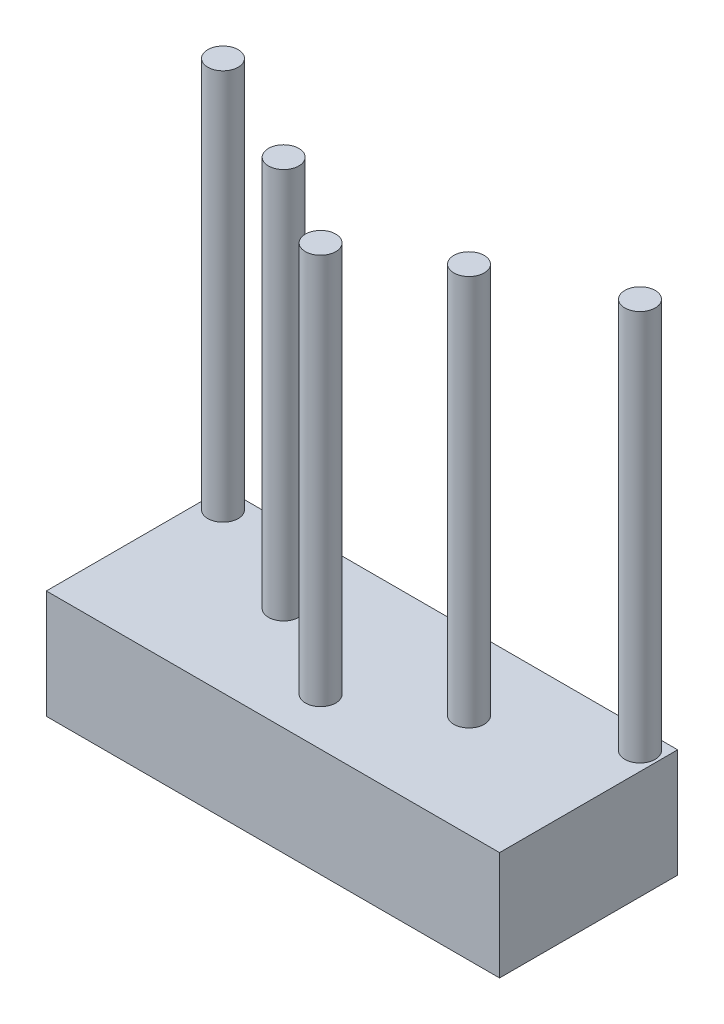
ISO-10303-21;
HEADER;
FILE_DESCRIPTION(('STEP AP214'),'2;1');
FILE_NAME('part.step','',(''),(''),'','','');
FILE_SCHEMA(('AUTOMOTIVE_DESIGN { 1 0 10303 214 1 1 1 1 }'));
ENDSEC;
DATA;
#1=APPLICATION_CONTEXT('core data for automotive mechanical design processes');
#2=APPLICATION_PROTOCOL_DEFINITION('international standard','automotive_design',2000,#1);
#3=PRODUCT_CONTEXT('',#1,'mechanical');
#4=PRODUCT('Part','Part','',(#3));
#5=PRODUCT_RELATED_PRODUCT_CATEGORY('part','',(#4));
#6=PRODUCT_DEFINITION_FORMATION('','',#4);
#7=PRODUCT_DEFINITION_CONTEXT('part definition',#1,'design');
#8=PRODUCT_DEFINITION('design','',#6,#7);
#9=PRODUCT_DEFINITION_SHAPE('','',#8);
#10=(LENGTH_UNIT() NAMED_UNIT(*) SI_UNIT(.MILLI.,.METRE.));
#11=(NAMED_UNIT(*) PLANE_ANGLE_UNIT() SI_UNIT($,.RADIAN.));
#12=(NAMED_UNIT(*) SI_UNIT($,.STERADIAN.) SOLID_ANGLE_UNIT());
#13=UNCERTAINTY_MEASURE_WITH_UNIT(LENGTH_MEASURE(1.E-05),#10,'distance_accuracy_value','');
#14=(GEOMETRIC_REPRESENTATION_CONTEXT(3) GLOBAL_UNCERTAINTY_ASSIGNED_CONTEXT((#13)) GLOBAL_UNIT_ASSIGNED_CONTEXT((#10,
#11,#12)) REPRESENTATION_CONTEXT('',''));
#15=CARTESIAN_POINT('',(0.,0.,0.));
#16=DIRECTION('',(0.,0.,1.));
#17=DIRECTION('',(1.,0.,0.));
#18=AXIS2_PLACEMENT_3D('',#15,#16,#17);
#19=CARTESIAN_POINT('',(-39.751,19.05,-15.621));
#20=DIRECTION('',(1.,0.,0.));
#21=DIRECTION('',(0.,0.,-1.));
#22=AXIS2_PLACEMENT_3D('',#19,#20,#21);
#23=PLANE('',#22);
#24=DIRECTION('',(0.,0.,1.));
#25=VECTOR('',#24,1.);
#26=CARTESIAN_POINT('',(-39.751,0.,-15.621));
#27=LINE('',#26,#25);
#28=CARTESIAN_POINT('',(-39.751,0.,-15.621));
#29=VERTEX_POINT('',#28);
#30=CARTESIAN_POINT('',(-39.751,0.,15.621));
#31=VERTEX_POINT('',#30);
#32=EDGE_CURVE('E99',#29,#31,#27,.T.);
#33=ORIENTED_EDGE('',*,*,#32,.T.);
#34=DIRECTION('',(0.,-1.,0.));
#35=VECTOR('',#34,1.);
#36=CARTESIAN_POINT('',(-39.751,19.05,15.621));
#37=LINE('',#36,#35);
#38=CARTESIAN_POINT('',(-39.751,19.05,15.621));
#39=VERTEX_POINT('',#38);
#40=EDGE_CURVE('E11',#39,#31,#37,.T.);
#41=ORIENTED_EDGE('',*,*,#40,.F.);
#42=DIRECTION('',(0.,0.,1.));
#43=VECTOR('',#42,1.);
#44=CARTESIAN_POINT('',(-39.751,19.05,-15.621));
#45=LINE('',#44,#43);
#46=CARTESIAN_POINT('',(-39.751,19.05,-15.621));
#47=VERTEX_POINT('',#46);
#48=EDGE_CURVE('E87',#47,#39,#45,.T.);
#49=ORIENTED_EDGE('',*,*,#48,.F.);
#50=DIRECTION('',(0.,-1.,0.));
#51=VECTOR('',#50,1.);
#52=CARTESIAN_POINT('',(-39.751,19.05,-15.621));
#53=LINE('',#52,#51);
#54=EDGE_CURVE('E95',#47,#29,#53,.T.);
#55=ORIENTED_EDGE('',*,*,#54,.T.);
#56=EDGE_LOOP('',(#33,#41,#49,#55));
#57=FACE_BOUND('',#56,.T.);
#58=ADVANCED_FACE('F36',(#57),#23,.F.);
#59=CARTESIAN_POINT('',(-39.751,19.05,15.621));
#60=DIRECTION('',(0.,0.,-1.));
#61=DIRECTION('',(-1.,0.,0.));
#62=AXIS2_PLACEMENT_3D('',#59,#60,#61);
#63=PLANE('',#62);
#64=DIRECTION('',(1.,0.,0.));
#65=VECTOR('',#64,1.);
#66=CARTESIAN_POINT('',(-39.751,0.,15.621));
#67=LINE('',#66,#65);
#68=CARTESIAN_POINT('',(39.751,0.,15.621));
#69=VERTEX_POINT('',#68);
#70=EDGE_CURVE('E91',#31,#69,#67,.T.);
#71=ORIENTED_EDGE('',*,*,#70,.T.);
#72=DIRECTION('',(0.,-1.,0.));
#73=VECTOR('',#72,1.);
#74=CARTESIAN_POINT('',(39.751,19.05,15.621));
#75=LINE('',#74,#73);
#76=CARTESIAN_POINT('',(39.751,19.05,15.621));
#77=VERTEX_POINT('',#76);
#78=EDGE_CURVE('E44',#77,#69,#75,.T.);
#79=ORIENTED_EDGE('',*,*,#78,.F.);
#80=DIRECTION('',(1.,0.,0.));
#81=VECTOR('',#80,1.);
#82=CARTESIAN_POINT('',(-39.751,19.05,15.621));
#83=LINE('',#82,#81);
#84=EDGE_CURVE('E82',#39,#77,#83,.T.);
#85=ORIENTED_EDGE('',*,*,#84,.F.);
#86=ORIENTED_EDGE('',*,*,#40,.T.);
#87=EDGE_LOOP('',(#71,#79,#85,#86));
#88=FACE_BOUND('',#87,.T.);
#89=ADVANCED_FACE('F90',(#88),#63,.F.);
#90=CARTESIAN_POINT('',(39.751,19.05,-15.621));
#91=DIRECTION('',(-1.,0.,0.));
#92=DIRECTION('',(0.,0.,1.));
#93=AXIS2_PLACEMENT_3D('',#90,#91,#92);
#94=PLANE('',#93);
#95=DIRECTION('',(0.,0.,-1.));
#96=VECTOR('',#95,1.);
#97=CARTESIAN_POINT('',(39.751,0.,-15.621));
#98=LINE('',#97,#96);
#99=CARTESIAN_POINT('',(39.751,0.,-15.621));
#100=VERTEX_POINT('',#99);
#101=EDGE_CURVE('E69',#69,#100,#98,.T.);
#102=ORIENTED_EDGE('',*,*,#101,.T.);
#103=DIRECTION('',(0.,-1.,0.));
#104=VECTOR('',#103,1.);
#105=CARTESIAN_POINT('',(39.751,19.05,-15.621));
#106=LINE('',#105,#104);
#107=CARTESIAN_POINT('',(39.751,19.05,-15.621));
#108=VERTEX_POINT('',#107);
#109=EDGE_CURVE('E92',#108,#100,#106,.T.);
#110=ORIENTED_EDGE('',*,*,#109,.F.);
#111=DIRECTION('',(0.,0.,-1.));
#112=VECTOR('',#111,1.);
#113=CARTESIAN_POINT('',(39.751,19.05,-15.621));
#114=LINE('',#113,#112);
#115=EDGE_CURVE('E85',#77,#108,#114,.T.);
#116=ORIENTED_EDGE('',*,*,#115,.F.);
#117=ORIENTED_EDGE('',*,*,#78,.T.);
#118=EDGE_LOOP('',(#102,#110,#116,#117));
#119=FACE_BOUND('',#118,.T.);
#120=ADVANCED_FACE('F93',(#119),#94,.F.);
#121=CARTESIAN_POINT('',(-39.751,19.05,-15.621));
#122=DIRECTION('',(0.,0.,1.));
#123=DIRECTION('',(1.,0.,0.));
#124=AXIS2_PLACEMENT_3D('',#121,#122,#123);
#125=PLANE('',#124);
#126=DIRECTION('',(-1.,0.,0.));
#127=VECTOR('',#126,1.);
#128=CARTESIAN_POINT('',(-39.751,0.,-15.621));
#129=LINE('',#128,#127);
#130=EDGE_CURVE('E75',#100,#29,#129,.T.);
#131=ORIENTED_EDGE('',*,*,#130,.T.);
#132=ORIENTED_EDGE('',*,*,#54,.F.);
#133=DIRECTION('',(-1.,0.,0.));
#134=VECTOR('',#133,1.);
#135=CARTESIAN_POINT('',(-39.751,19.05,-15.621));
#136=LINE('',#135,#134);
#137=EDGE_CURVE('E52',#108,#47,#136,.T.);
#138=ORIENTED_EDGE('',*,*,#137,.F.);
#139=ORIENTED_EDGE('',*,*,#109,.T.);
#140=EDGE_LOOP('',(#131,#132,#138,#139));
#141=FACE_BOUND('',#140,.T.);
#142=ADVANCED_FACE('F107',(#141),#125,.F.);
#143=CARTESIAN_POINT('',(0.,19.05,0.));
#144=DIRECTION('',(0.,1.,0.));
#145=DIRECTION('',(0.,0.,1.));
#146=AXIS2_PLACEMENT_3D('',#143,#144,#145);
#147=PLANE('',#146);
#148=CARTESIAN_POINT('',(36.576,19.05,-12.192));
#149=DIRECTION('',(0.,1.,0.));
#150=DIRECTION('',(0.,0.,1.));
#151=AXIS2_PLACEMENT_3D('',#148,#149,#150);
#152=CIRCLE('',#151,2.667);
#153=CARTESIAN_POINT('',(36.576,19.05,-9.525));
#154=VERTEX_POINT('',#153);
#155=EDGE_CURVE('E137',#154,#154,#152,.T.);
#156=ORIENTED_EDGE('',*,*,#155,.F.);
#157=EDGE_LOOP('',(#156));
#158=FACE_BOUND('',#157,.T.);
#159=CARTESIAN_POINT('',(16.256,19.05,-2.51513147919641));
#160=DIRECTION('',(0.,1.,0.));
#161=DIRECTION('',(0.,0.,1.));
#162=AXIS2_PLACEMENT_3D('',#159,#160,#161);
#163=CIRCLE('',#162,2.667);
#164=CARTESIAN_POINT('',(16.256,19.05,0.151868520803589));
#165=VERTEX_POINT('',#164);
#166=EDGE_CURVE('E131',#165,#165,#163,.T.);
#167=ORIENTED_EDGE('',*,*,#166,.F.);
#168=EDGE_LOOP('',(#167));
#169=FACE_BOUND('',#168,.T.);
#170=CARTESIAN_POINT('',(0.,19.05,7.26386852080359));
#171=DIRECTION('',(0.,1.,0.));
#172=DIRECTION('',(0.,0.,1.));
#173=AXIS2_PLACEMENT_3D('',#170,#171,#172);
#174=CIRCLE('',#173,2.667);
#175=CARTESIAN_POINT('',(0.,19.05,9.93086852080359));
#176=VERTEX_POINT('',#175);
#177=EDGE_CURVE('E125',#176,#176,#174,.T.);
#178=ORIENTED_EDGE('',*,*,#177,.F.);
#179=EDGE_LOOP('',(#178));
#180=FACE_BOUND('',#179,.T.);
#181=CARTESIAN_POINT('',(-16.256,19.05,-2.51513147919641));
#182=DIRECTION('',(0.,1.,0.));
#183=DIRECTION('',(0.,0.,1.));
#184=AXIS2_PLACEMENT_3D('',#181,#182,#183);
#185=CIRCLE('',#184,2.667);
#186=CARTESIAN_POINT('',(-16.256,19.05,0.151868520803589));
#187=VERTEX_POINT('',#186);
#188=EDGE_CURVE('E119',#187,#187,#185,.T.);
#189=ORIENTED_EDGE('',*,*,#188,.F.);
#190=EDGE_LOOP('',(#189));
#191=FACE_BOUND('',#190,.T.);
#192=CARTESIAN_POINT('',(-36.576,19.05,-12.192));
#193=DIRECTION('',(0.,1.,0.));
#194=DIRECTION('',(0.,0.,1.));
#195=AXIS2_PLACEMENT_3D('',#192,#193,#194);
#196=CIRCLE('',#195,2.667);
#197=CARTESIAN_POINT('',(-36.576,19.05,-9.525));
#198=VERTEX_POINT('',#197);
#199=EDGE_CURVE('E113',#198,#198,#196,.T.);
#200=ORIENTED_EDGE('',*,*,#199,.F.);
#201=EDGE_LOOP('',(#200));
#202=FACE_BOUND('',#201,.T.);
#203=ORIENTED_EDGE('',*,*,#48,.T.);
#204=ORIENTED_EDGE('',*,*,#84,.T.);
#205=ORIENTED_EDGE('',*,*,#115,.T.);
#206=ORIENTED_EDGE('',*,*,#137,.T.);
#207=EDGE_LOOP('',(#203,#204,#205,#206));
#208=FACE_BOUND('',#207,.T.);
#209=ADVANCED_FACE('F83',(#158,#169,#180,#191,#202,#208),#147,.T.);
#210=CARTESIAN_POINT('',(0.,0.,0.));
#211=DIRECTION('',(0.,1.,0.));
#212=DIRECTION('',(0.,0.,1.));
#213=AXIS2_PLACEMENT_3D('',#210,#211,#212);
#214=PLANE('',#213);
#215=ORIENTED_EDGE('',*,*,#32,.F.);
#216=ORIENTED_EDGE('',*,*,#130,.F.);
#217=ORIENTED_EDGE('',*,*,#101,.F.);
#218=ORIENTED_EDGE('',*,*,#70,.F.);
#219=EDGE_LOOP('',(#215,#216,#217,#218));
#220=FACE_BOUND('',#219,.T.);
#221=ADVANCED_FACE('F110',(#220),#214,.F.);
#222=CARTESIAN_POINT('',(-36.576,87.63,-12.192));
#223=DIRECTION('',(0.,-1.,0.));
#224=DIRECTION('',(0.,0.,-1.));
#225=AXIS2_PLACEMENT_3D('',#222,#223,#224);
#226=CYLINDRICAL_SURFACE('',#225,2.667);
#227=CARTESIAN_POINT('',(-36.576,87.63,-12.192));
#228=DIRECTION('',(0.,1.,0.));
#229=DIRECTION('',(0.,0.,1.));
#230=AXIS2_PLACEMENT_3D('',#227,#228,#229);
#231=CIRCLE('',#230,2.667);
#232=CARTESIAN_POINT('',(-36.576,87.63,-9.525));
#233=VERTEX_POINT('',#232);
#234=EDGE_CURVE('E102',#233,#233,#231,.T.);
#235=ORIENTED_EDGE('',*,*,#234,.F.);
#236=EDGE_LOOP('',(#235));
#237=FACE_BOUND('',#236,.T.);
#238=ORIENTED_EDGE('',*,*,#199,.T.);
#239=EDGE_LOOP('',(#238));
#240=FACE_BOUND('',#239,.T.);
#241=ADVANCED_FACE('F163',(#237,#240),#226,.T.);
#242=CARTESIAN_POINT('',(-36.576,87.63,-12.192));
#243=DIRECTION('',(0.,1.,0.));
#244=DIRECTION('',(0.,0.,1.));
#245=AXIS2_PLACEMENT_3D('',#242,#243,#244);
#246=PLANE('',#245);
#247=ORIENTED_EDGE('',*,*,#234,.T.);
#248=EDGE_LOOP('',(#247));
#249=FACE_BOUND('',#248,.T.);
#250=ADVANCED_FACE('F165',(#249),#246,.T.);
#251=CARTESIAN_POINT('',(-16.256,87.63,-2.51513147919641));
#252=DIRECTION('',(0.,-1.,0.));
#253=DIRECTION('',(0.,0.,-1.));
#254=AXIS2_PLACEMENT_3D('',#251,#252,#253);
#255=CYLINDRICAL_SURFACE('',#254,2.667);
#256=CARTESIAN_POINT('',(-16.256,87.63,-2.51513147919641));
#257=DIRECTION('',(0.,1.,0.));
#258=DIRECTION('',(0.,0.,1.));
#259=AXIS2_PLACEMENT_3D('',#256,#257,#258);
#260=CIRCLE('',#259,2.667);
#261=CARTESIAN_POINT('',(-16.256,87.63,0.151868520803589));
#262=VERTEX_POINT('',#261);
#263=EDGE_CURVE('E116',#262,#262,#260,.T.);
#264=ORIENTED_EDGE('',*,*,#263,.F.);
#265=EDGE_LOOP('',(#264));
#266=FACE_BOUND('',#265,.T.);
#267=ORIENTED_EDGE('',*,*,#188,.T.);
#268=EDGE_LOOP('',(#267));
#269=FACE_BOUND('',#268,.T.);
#270=ADVANCED_FACE('F172',(#266,#269),#255,.T.);
#271=CARTESIAN_POINT('',(-16.256,87.63,-2.51513147919641));
#272=DIRECTION('',(0.,1.,0.));
#273=DIRECTION('',(0.,0.,1.));
#274=AXIS2_PLACEMENT_3D('',#271,#272,#273);
#275=PLANE('',#274);
#276=ORIENTED_EDGE('',*,*,#263,.T.);
#277=EDGE_LOOP('',(#276));
#278=FACE_BOUND('',#277,.T.);
#279=ADVANCED_FACE('F220',(#278),#275,.T.);
#280=CARTESIAN_POINT('',(0.,87.63,7.26386852080359));
#281=DIRECTION('',(0.,-1.,0.));
#282=DIRECTION('',(0.,0.,-1.));
#283=AXIS2_PLACEMENT_3D('',#280,#281,#282);
#284=CYLINDRICAL_SURFACE('',#283,2.667);
#285=CARTESIAN_POINT('',(0.,87.63,7.26386852080359));
#286=DIRECTION('',(0.,1.,0.));
#287=DIRECTION('',(0.,0.,1.));
#288=AXIS2_PLACEMENT_3D('',#285,#286,#287);
#289=CIRCLE('',#288,2.667);
#290=CARTESIAN_POINT('',(0.,87.63,9.93086852080359));
#291=VERTEX_POINT('',#290);
#292=EDGE_CURVE('E122',#291,#291,#289,.T.);
#293=ORIENTED_EDGE('',*,*,#292,.F.);
#294=EDGE_LOOP('',(#293));
#295=FACE_BOUND('',#294,.T.);
#296=ORIENTED_EDGE('',*,*,#177,.T.);
#297=EDGE_LOOP('',(#296));
#298=FACE_BOUND('',#297,.T.);
#299=ADVANCED_FACE('F229',(#295,#298),#284,.T.);
#300=CARTESIAN_POINT('',(0.,87.63,7.26386852080359));
#301=DIRECTION('',(0.,1.,0.));
#302=DIRECTION('',(0.,0.,1.));
#303=AXIS2_PLACEMENT_3D('',#300,#301,#302);
#304=PLANE('',#303);
#305=ORIENTED_EDGE('',*,*,#292,.T.);
#306=EDGE_LOOP('',(#305));
#307=FACE_BOUND('',#306,.T.);
#308=ADVANCED_FACE('F238',(#307),#304,.T.);
#309=CARTESIAN_POINT('',(16.256,87.63,-2.51513147919641));
#310=DIRECTION('',(0.,-1.,0.));
#311=DIRECTION('',(0.,0.,-1.));
#312=AXIS2_PLACEMENT_3D('',#309,#310,#311);
#313=CYLINDRICAL_SURFACE('',#312,2.667);
#314=CARTESIAN_POINT('',(16.256,87.63,-2.51513147919641));
#315=DIRECTION('',(0.,1.,0.));
#316=DIRECTION('',(0.,0.,1.));
#317=AXIS2_PLACEMENT_3D('',#314,#315,#316);
#318=CIRCLE('',#317,2.667);
#319=CARTESIAN_POINT('',(16.256,87.63,0.151868520803589));
#320=VERTEX_POINT('',#319);
#321=EDGE_CURVE('E128',#320,#320,#318,.T.);
#322=ORIENTED_EDGE('',*,*,#321,.F.);
#323=EDGE_LOOP('',(#322));
#324=FACE_BOUND('',#323,.T.);
#325=ORIENTED_EDGE('',*,*,#166,.T.);
#326=EDGE_LOOP('',(#325));
#327=FACE_BOUND('',#326,.T.);
#328=ADVANCED_FACE('F247',(#324,#327),#313,.T.);
#329=CARTESIAN_POINT('',(16.256,87.63,-2.51513147919641));
#330=DIRECTION('',(0.,1.,0.));
#331=DIRECTION('',(0.,0.,1.));
#332=AXIS2_PLACEMENT_3D('',#329,#330,#331);
#333=PLANE('',#332);
#334=ORIENTED_EDGE('',*,*,#321,.T.);
#335=EDGE_LOOP('',(#334));
#336=FACE_BOUND('',#335,.T.);
#337=ADVANCED_FACE('F148',(#336),#333,.T.);
#338=CARTESIAN_POINT('',(36.576,87.63,-12.192));
#339=DIRECTION('',(0.,-1.,0.));
#340=DIRECTION('',(0.,0.,-1.));
#341=AXIS2_PLACEMENT_3D('',#338,#339,#340);
#342=CYLINDRICAL_SURFACE('',#341,2.667);
#343=CARTESIAN_POINT('',(36.576,87.63,-12.192));
#344=DIRECTION('',(0.,1.,0.));
#345=DIRECTION('',(0.,0.,1.));
#346=AXIS2_PLACEMENT_3D('',#343,#344,#345);
#347=CIRCLE('',#346,2.667);
#348=CARTESIAN_POINT('',(36.576,87.63,-9.525));
#349=VERTEX_POINT('',#348);
#350=EDGE_CURVE('E134',#349,#349,#347,.T.);
#351=ORIENTED_EDGE('',*,*,#350,.F.);
#352=EDGE_LOOP('',(#351));
#353=FACE_BOUND('',#352,.T.);
#354=ORIENTED_EDGE('',*,*,#155,.T.);
#355=EDGE_LOOP('',(#354));
#356=FACE_BOUND('',#355,.T.);
#357=ADVANCED_FACE('F145',(#353,#356),#342,.T.);
#358=CARTESIAN_POINT('',(36.576,87.63,-12.192));
#359=DIRECTION('',(0.,1.,0.));
#360=DIRECTION('',(0.,0.,1.));
#361=AXIS2_PLACEMENT_3D('',#358,#359,#360);
#362=PLANE('',#361);
#363=ORIENTED_EDGE('',*,*,#350,.T.);
#364=EDGE_LOOP('',(#363));
#365=FACE_BOUND('',#364,.T.);
#366=ADVANCED_FACE('F143',(#365),#362,.T.);
#367=CLOSED_SHELL('',(#58,#89,#120,#142,#209,#221,#241,#250,#270,#279,#299,#308,#328,#337,#357,#366));
#368=MANIFOLD_SOLID_BREP('B2',#367);
#369=ADVANCED_BREP_SHAPE_REPRESENTATION('',(#18,#368),#14);
#370=SHAPE_DEFINITION_REPRESENTATION(#9,#369);
ENDSEC;
END-ISO-10303-21;
